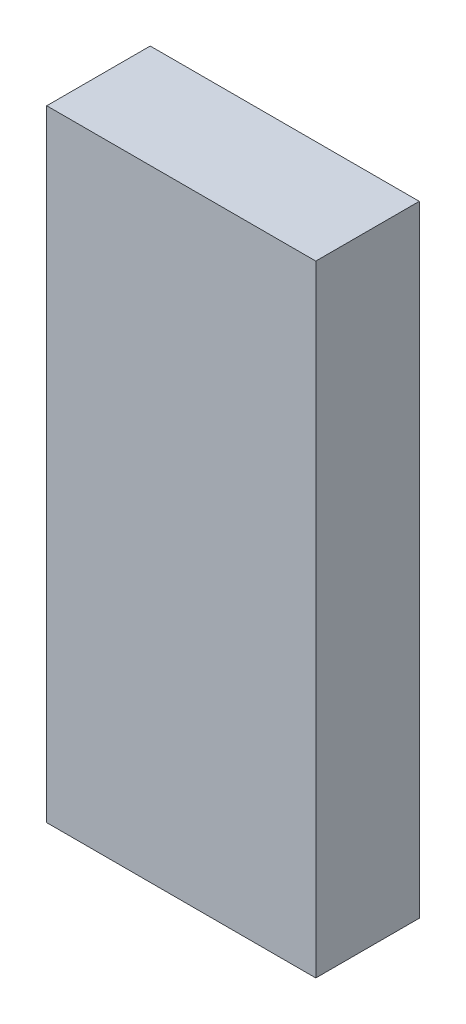
ISO-10303-21;
HEADER;
FILE_DESCRIPTION(('STEP AP214'),'2;1');
FILE_NAME('part.step','',(''),(''),'','','');
FILE_SCHEMA(('AUTOMOTIVE_DESIGN { 1 0 10303 214 1 1 1 1 }'));
ENDSEC;
DATA;
#1=APPLICATION_CONTEXT('core data for automotive mechanical design processes');
#2=APPLICATION_PROTOCOL_DEFINITION('international standard','automotive_design',2000,#1);
#3=PRODUCT_CONTEXT('',#1,'mechanical');
#4=PRODUCT('Part','Part','',(#3));
#5=PRODUCT_RELATED_PRODUCT_CATEGORY('part','',(#4));
#6=PRODUCT_DEFINITION_FORMATION('','',#4);
#7=PRODUCT_DEFINITION_CONTEXT('part definition',#1,'design');
#8=PRODUCT_DEFINITION('design','',#6,#7);
#9=PRODUCT_DEFINITION_SHAPE('','',#8);
#10=(LENGTH_UNIT() NAMED_UNIT(*) SI_UNIT(.MILLI.,.METRE.));
#11=(NAMED_UNIT(*) PLANE_ANGLE_UNIT() SI_UNIT($,.RADIAN.));
#12=(NAMED_UNIT(*) SI_UNIT($,.STERADIAN.) SOLID_ANGLE_UNIT());
#13=UNCERTAINTY_MEASURE_WITH_UNIT(LENGTH_MEASURE(1.E-05),#10,'distance_accuracy_value','');
#14=(GEOMETRIC_REPRESENTATION_CONTEXT(3) GLOBAL_UNCERTAINTY_ASSIGNED_CONTEXT((#13)) GLOBAL_UNIT_ASSIGNED_CONTEXT((#10,
#11,#12)) REPRESENTATION_CONTEXT('',''));
#15=CARTESIAN_POINT('',(0.,0.,0.));
#16=DIRECTION('',(0.,0.,1.));
#17=DIRECTION('',(1.,0.,0.));
#18=AXIS2_PLACEMENT_3D('',#15,#16,#17);
#19=CARTESIAN_POINT('',(-41.2810879814954,150.,-0.839363235636416));
#20=DIRECTION('',(1.,0.,0.));
#21=DIRECTION('',(0.,0.,-1.));
#22=AXIS2_PLACEMENT_3D('',#19,#20,#21);
#23=PLANE('',#22);
#24=DIRECTION('',(0.,0.,1.));
#25=VECTOR('',#24,1.);
#26=CARTESIAN_POINT('',(-41.2810879814954,0.,-0.839363235636416));
#27=LINE('',#26,#25);
#28=CARTESIAN_POINT('',(-41.2810879814954,0.,-0.839363235636416));
#29=VERTEX_POINT('',#28);
#30=CARTESIAN_POINT('',(-41.2810879814954,0.,24.1606367643636));
#31=VERTEX_POINT('',#30);
#32=EDGE_CURVE('E95',#29,#31,#27,.T.);
#33=ORIENTED_EDGE('',*,*,#32,.T.);
#34=DIRECTION('',(0.,-1.,0.));
#35=VECTOR('',#34,1.);
#36=CARTESIAN_POINT('',(-41.2810879814954,150.,24.1606367643636));
#37=LINE('',#36,#35);
#38=CARTESIAN_POINT('',(-41.2810879814954,150.,24.1606367643636));
#39=VERTEX_POINT('',#38);
#40=EDGE_CURVE('E11',#39,#31,#37,.T.);
#41=ORIENTED_EDGE('',*,*,#40,.F.);
#42=DIRECTION('',(0.,0.,1.));
#43=VECTOR('',#42,1.);
#44=CARTESIAN_POINT('',(-41.2810879814954,150.,-0.839363235636416));
#45=LINE('',#44,#43);
#46=CARTESIAN_POINT('',(-41.2810879814954,150.,-0.839363235636416));
#47=VERTEX_POINT('',#46);
#48=EDGE_CURVE('E83',#47,#39,#45,.T.);
#49=ORIENTED_EDGE('',*,*,#48,.F.);
#50=DIRECTION('',(0.,-1.,0.));
#51=VECTOR('',#50,1.);
#52=CARTESIAN_POINT('',(-41.2810879814954,150.,-0.839363235636416));
#53=LINE('',#52,#51);
#54=EDGE_CURVE('E91',#47,#29,#53,.T.);
#55=ORIENTED_EDGE('',*,*,#54,.T.);
#56=EDGE_LOOP('',(#33,#41,#49,#55));
#57=FACE_BOUND('',#56,.T.);
#58=ADVANCED_FACE('F32',(#57),#23,.F.);
#59=CARTESIAN_POINT('',(-41.2810879814954,150.,24.1606367643636));
#60=DIRECTION('',(0.,0.,-1.));
#61=DIRECTION('',(-1.,0.,0.));
#62=AXIS2_PLACEMENT_3D('',#59,#60,#61);
#63=PLANE('',#62);
#64=DIRECTION('',(1.,0.,0.));
#65=VECTOR('',#64,1.);
#66=CARTESIAN_POINT('',(-41.2810879814954,0.,24.1606367643636));
#67=LINE('',#66,#65);
#68=CARTESIAN_POINT('',(23.7189120185046,0.,24.1606367643636));
#69=VERTEX_POINT('',#68);
#70=EDGE_CURVE('E87',#31,#69,#67,.T.);
#71=ORIENTED_EDGE('',*,*,#70,.T.);
#72=DIRECTION('',(0.,-1.,0.));
#73=VECTOR('',#72,1.);
#74=CARTESIAN_POINT('',(23.7189120185046,150.,24.1606367643636));
#75=LINE('',#74,#73);
#76=CARTESIAN_POINT('',(23.7189120185046,150.,24.1606367643636));
#77=VERTEX_POINT('',#76);
#78=EDGE_CURVE('E40',#77,#69,#75,.T.);
#79=ORIENTED_EDGE('',*,*,#78,.F.);
#80=DIRECTION('',(1.,0.,0.));
#81=VECTOR('',#80,1.);
#82=CARTESIAN_POINT('',(-41.2810879814954,150.,24.1606367643636));
#83=LINE('',#82,#81);
#84=EDGE_CURVE('E78',#39,#77,#83,.T.);
#85=ORIENTED_EDGE('',*,*,#84,.F.);
#86=ORIENTED_EDGE('',*,*,#40,.T.);
#87=EDGE_LOOP('',(#71,#79,#85,#86));
#88=FACE_BOUND('',#87,.T.);
#89=ADVANCED_FACE('F86',(#88),#63,.F.);
#90=CARTESIAN_POINT('',(23.7189120185046,150.,-0.839363235636416));
#91=DIRECTION('',(-1.,0.,0.));
#92=DIRECTION('',(0.,0.,1.));
#93=AXIS2_PLACEMENT_3D('',#90,#91,#92);
#94=PLANE('',#93);
#95=DIRECTION('',(0.,0.,-1.));
#96=VECTOR('',#95,1.);
#97=CARTESIAN_POINT('',(23.7189120185046,0.,-0.839363235636416));
#98=LINE('',#97,#96);
#99=CARTESIAN_POINT('',(23.7189120185046,0.,-0.839363235636416));
#100=VERTEX_POINT('',#99);
#101=EDGE_CURVE('E65',#69,#100,#98,.T.);
#102=ORIENTED_EDGE('',*,*,#101,.T.);
#103=DIRECTION('',(0.,-1.,0.));
#104=VECTOR('',#103,1.);
#105=CARTESIAN_POINT('',(23.7189120185046,150.,-0.839363235636416));
#106=LINE('',#105,#104);
#107=CARTESIAN_POINT('',(23.7189120185046,150.,-0.839363235636416));
#108=VERTEX_POINT('',#107);
#109=EDGE_CURVE('E88',#108,#100,#106,.T.);
#110=ORIENTED_EDGE('',*,*,#109,.F.);
#111=DIRECTION('',(0.,0.,-1.));
#112=VECTOR('',#111,1.);
#113=CARTESIAN_POINT('',(23.7189120185046,150.,-0.839363235636416));
#114=LINE('',#113,#112);
#115=EDGE_CURVE('E81',#77,#108,#114,.T.);
#116=ORIENTED_EDGE('',*,*,#115,.F.);
#117=ORIENTED_EDGE('',*,*,#78,.T.);
#118=EDGE_LOOP('',(#102,#110,#116,#117));
#119=FACE_BOUND('',#118,.T.);
#120=ADVANCED_FACE('F89',(#119),#94,.F.);
#121=CARTESIAN_POINT('',(-41.2810879814954,150.,-0.839363235636416));
#122=DIRECTION('',(0.,0.,1.));
#123=DIRECTION('',(1.,0.,0.));
#124=AXIS2_PLACEMENT_3D('',#121,#122,#123);
#125=PLANE('',#124);
#126=DIRECTION('',(-1.,0.,0.));
#127=VECTOR('',#126,1.);
#128=CARTESIAN_POINT('',(-41.2810879814954,0.,-0.839363235636416));
#129=LINE('',#128,#127);
#130=EDGE_CURVE('E71',#100,#29,#129,.T.);
#131=ORIENTED_EDGE('',*,*,#130,.T.);
#132=ORIENTED_EDGE('',*,*,#54,.F.);
#133=DIRECTION('',(-1.,0.,0.));
#134=VECTOR('',#133,1.);
#135=CARTESIAN_POINT('',(-41.2810879814954,150.,-0.839363235636416));
#136=LINE('',#135,#134);
#137=EDGE_CURVE('E48',#108,#47,#136,.T.);
#138=ORIENTED_EDGE('',*,*,#137,.F.);
#139=ORIENTED_EDGE('',*,*,#109,.T.);
#140=EDGE_LOOP('',(#131,#132,#138,#139));
#141=FACE_BOUND('',#140,.T.);
#142=ADVANCED_FACE('F102',(#141),#125,.F.);
#143=CARTESIAN_POINT('',(0.,150.,0.));
#144=DIRECTION('',(0.,1.,0.));
#145=DIRECTION('',(0.,0.,1.));
#146=AXIS2_PLACEMENT_3D('',#143,#144,#145);
#147=PLANE('',#146);
#148=ORIENTED_EDGE('',*,*,#48,.T.);
#149=ORIENTED_EDGE('',*,*,#84,.T.);
#150=ORIENTED_EDGE('',*,*,#115,.T.);
#151=ORIENTED_EDGE('',*,*,#137,.T.);
#152=EDGE_LOOP('',(#148,#149,#150,#151));
#153=FACE_BOUND('',#152,.T.);
#154=ADVANCED_FACE('F79',(#153),#147,.T.);
#155=CARTESIAN_POINT('',(0.,0.,0.));
#156=DIRECTION('',(0.,1.,0.));
#157=DIRECTION('',(0.,0.,1.));
#158=AXIS2_PLACEMENT_3D('',#155,#156,#157);
#159=PLANE('',#158);
#160=ORIENTED_EDGE('',*,*,#32,.F.);
#161=ORIENTED_EDGE('',*,*,#130,.F.);
#162=ORIENTED_EDGE('',*,*,#101,.F.);
#163=ORIENTED_EDGE('',*,*,#70,.F.);
#164=EDGE_LOOP('',(#160,#161,#162,#163));
#165=FACE_BOUND('',#164,.T.);
#166=ADVANCED_FACE('F105',(#165),#159,.F.);
#167=CLOSED_SHELL('',(#58,#89,#120,#142,#154,#166));
#168=MANIFOLD_SOLID_BREP('B2',#167);
#169=ADVANCED_BREP_SHAPE_REPRESENTATION('',(#18,#168),#14);
#170=SHAPE_DEFINITION_REPRESENTATION(#9,#169);
ENDSEC;
END-ISO-10303-21;
